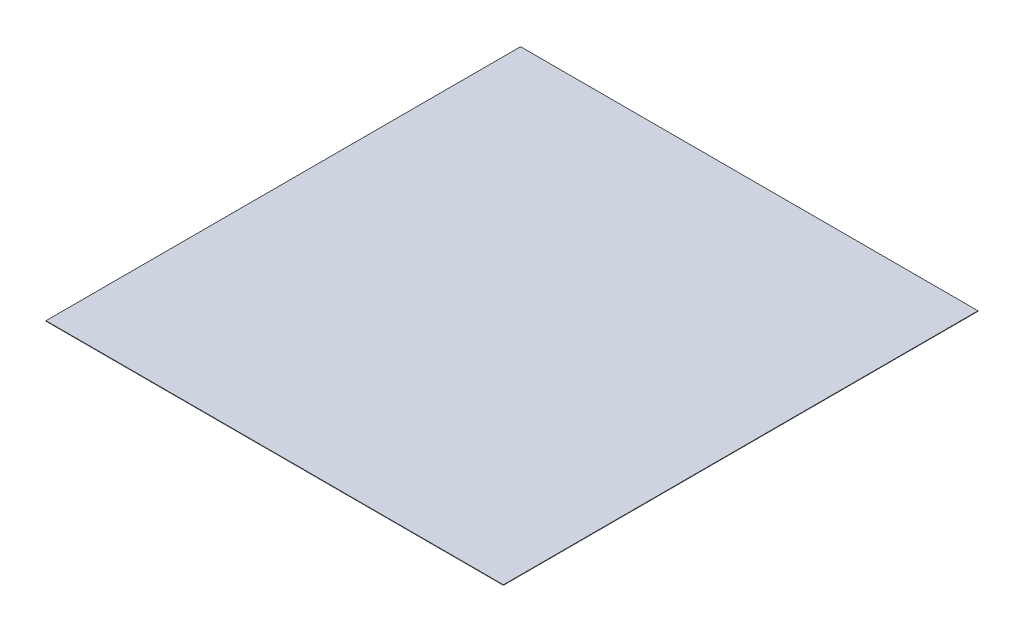
ISO-10303-21;
HEADER;
FILE_DESCRIPTION(('STEP AP214'),'2;1');
FILE_NAME('part.step','',(''),(''),'','','');
FILE_SCHEMA(('AUTOMOTIVE_DESIGN { 1 0 10303 214 1 1 1 1 }'));
ENDSEC;
DATA;
#1=APPLICATION_CONTEXT('core data for automotive mechanical design processes');
#2=APPLICATION_PROTOCOL_DEFINITION('international standard','automotive_design',2000,#1);
#3=PRODUCT_CONTEXT('',#1,'mechanical');
#4=PRODUCT('Part','Part','',(#3));
#5=PRODUCT_RELATED_PRODUCT_CATEGORY('part','',(#4));
#6=PRODUCT_DEFINITION_FORMATION('','',#4);
#7=PRODUCT_DEFINITION_CONTEXT('part definition',#1,'design');
#8=PRODUCT_DEFINITION('design','',#6,#7);
#9=PRODUCT_DEFINITION_SHAPE('','',#8);
#10=(LENGTH_UNIT() NAMED_UNIT(*) SI_UNIT(.MILLI.,.METRE.));
#11=(NAMED_UNIT(*) PLANE_ANGLE_UNIT() SI_UNIT($,.RADIAN.));
#12=(NAMED_UNIT(*) SI_UNIT($,.STERADIAN.) SOLID_ANGLE_UNIT());
#13=UNCERTAINTY_MEASURE_WITH_UNIT(LENGTH_MEASURE(1.E-05),#10,'distance_accuracy_value','');
#14=(GEOMETRIC_REPRESENTATION_CONTEXT(3) GLOBAL_UNCERTAINTY_ASSIGNED_CONTEXT((#13)) GLOBAL_UNIT_ASSIGNED_CONTEXT((#10,
#11,#12)) REPRESENTATION_CONTEXT('',''));
#15=CARTESIAN_POINT('',(0.,0.,0.));
#16=DIRECTION('',(0.,0.,1.));
#17=DIRECTION('',(1.,0.,0.));
#18=AXIS2_PLACEMENT_3D('',#15,#16,#17);
#19=CARTESIAN_POINT('',(-500.,1.,-518.75));
#20=DIRECTION('',(1.,0.,0.));
#21=DIRECTION('',(0.,0.,-1.));
#22=AXIS2_PLACEMENT_3D('',#19,#20,#21);
#23=PLANE('',#22);
#24=DIRECTION('',(0.,0.,1.));
#25=VECTOR('',#24,1.);
#26=CARTESIAN_POINT('',(-500.,0.,-518.75));
#27=LINE('',#26,#25);
#28=CARTESIAN_POINT('',(-500.,0.,-518.75));
#29=VERTEX_POINT('',#28);
#30=CARTESIAN_POINT('',(-500.,0.,518.75));
#31=VERTEX_POINT('',#30);
#32=EDGE_CURVE('E106',#29,#31,#27,.T.);
#33=ORIENTED_EDGE('',*,*,#32,.T.);
#34=DIRECTION('',(0.,-1.,0.));
#35=VECTOR('',#34,1.);
#36=CARTESIAN_POINT('',(-500.,1.,518.75));
#37=LINE('',#36,#35);
#38=CARTESIAN_POINT('',(-500.,1.,518.75));
#39=VERTEX_POINT('',#38);
#40=EDGE_CURVE('E11',#39,#31,#37,.T.);
#41=ORIENTED_EDGE('',*,*,#40,.F.);
#42=DIRECTION('',(0.,0.,1.));
#43=VECTOR('',#42,1.);
#44=CARTESIAN_POINT('',(-500.,1.,-518.75));
#45=LINE('',#44,#43);
#46=CARTESIAN_POINT('',(-500.,1.,-518.75));
#47=VERTEX_POINT('',#46);
#48=EDGE_CURVE('E94',#47,#39,#45,.T.);
#49=ORIENTED_EDGE('',*,*,#48,.F.);
#50=DIRECTION('',(0.,-1.,0.));
#51=VECTOR('',#50,1.);
#52=CARTESIAN_POINT('',(-500.,1.,-518.75));
#53=LINE('',#52,#51);
#54=EDGE_CURVE('E102',#47,#29,#53,.T.);
#55=ORIENTED_EDGE('',*,*,#54,.T.);
#56=EDGE_LOOP('',(#33,#41,#49,#55));
#57=FACE_BOUND('',#56,.T.);
#58=ADVANCED_FACE('F43',(#57),#23,.F.);
#59=CARTESIAN_POINT('',(500.,1.,518.75));
#60=DIRECTION('',(0.,0.,-1.));
#61=DIRECTION('',(-1.,0.,0.));
#62=AXIS2_PLACEMENT_3D('',#59,#60,#61);
#63=PLANE('',#62);
#64=DIRECTION('',(1.,0.,0.));
#65=VECTOR('',#64,1.);
#66=CARTESIAN_POINT('',(500.,0.,518.75));
#67=LINE('',#66,#65);
#68=CARTESIAN_POINT('',(500.,0.,518.75));
#69=VERTEX_POINT('',#68);
#70=EDGE_CURVE('E98',#31,#69,#67,.T.);
#71=ORIENTED_EDGE('',*,*,#70,.T.);
#72=DIRECTION('',(0.,-1.,0.));
#73=VECTOR('',#72,1.);
#74=CARTESIAN_POINT('',(500.,1.,518.75));
#75=LINE('',#74,#73);
#76=CARTESIAN_POINT('',(500.,1.,518.75));
#77=VERTEX_POINT('',#76);
#78=EDGE_CURVE('E51',#77,#69,#75,.T.);
#79=ORIENTED_EDGE('',*,*,#78,.F.);
#80=DIRECTION('',(1.,0.,0.));
#81=VECTOR('',#80,1.);
#82=CARTESIAN_POINT('',(500.,1.,518.75));
#83=LINE('',#82,#81);
#84=EDGE_CURVE('E89',#39,#77,#83,.T.);
#85=ORIENTED_EDGE('',*,*,#84,.F.);
#86=ORIENTED_EDGE('',*,*,#40,.T.);
#87=EDGE_LOOP('',(#71,#79,#85,#86));
#88=FACE_BOUND('',#87,.T.);
#89=ADVANCED_FACE('F97',(#88),#63,.F.);
#90=CARTESIAN_POINT('',(500.,1.,-518.75));
#91=DIRECTION('',(-1.,0.,0.));
#92=DIRECTION('',(0.,0.,1.));
#93=AXIS2_PLACEMENT_3D('',#90,#91,#92);
#94=PLANE('',#93);
#95=DIRECTION('',(0.,0.,-1.));
#96=VECTOR('',#95,1.);
#97=CARTESIAN_POINT('',(500.,0.,-518.75));
#98=LINE('',#97,#96);
#99=CARTESIAN_POINT('',(500.,0.,-518.75));
#100=VERTEX_POINT('',#99);
#101=EDGE_CURVE('E76',#69,#100,#98,.T.);
#102=ORIENTED_EDGE('',*,*,#101,.T.);
#103=DIRECTION('',(0.,-1.,0.));
#104=VECTOR('',#103,1.);
#105=CARTESIAN_POINT('',(500.,1.,-518.75));
#106=LINE('',#105,#104);
#107=CARTESIAN_POINT('',(500.,1.,-518.75));
#108=VERTEX_POINT('',#107);
#109=EDGE_CURVE('E99',#108,#100,#106,.T.);
#110=ORIENTED_EDGE('',*,*,#109,.F.);
#111=DIRECTION('',(0.,0.,-1.));
#112=VECTOR('',#111,1.);
#113=CARTESIAN_POINT('',(500.,1.,-518.75));
#114=LINE('',#113,#112);
#115=EDGE_CURVE('E92',#77,#108,#114,.T.);
#116=ORIENTED_EDGE('',*,*,#115,.F.);
#117=ORIENTED_EDGE('',*,*,#78,.T.);
#118=EDGE_LOOP('',(#102,#110,#116,#117));
#119=FACE_BOUND('',#118,.T.);
#120=ADVANCED_FACE('F100',(#119),#94,.F.);
#121=CARTESIAN_POINT('',(500.,1.,-518.75));
#122=DIRECTION('',(0.,0.,1.));
#123=DIRECTION('',(1.,0.,0.));
#124=AXIS2_PLACEMENT_3D('',#121,#122,#123);
#125=PLANE('',#124);
#126=DIRECTION('',(-1.,0.,0.));
#127=VECTOR('',#126,1.);
#128=CARTESIAN_POINT('',(500.,0.,-518.75));
#129=LINE('',#128,#127);
#130=EDGE_CURVE('E82',#100,#29,#129,.T.);
#131=ORIENTED_EDGE('',*,*,#130,.T.);
#132=ORIENTED_EDGE('',*,*,#54,.F.);
#133=DIRECTION('',(-1.,0.,0.));
#134=VECTOR('',#133,1.);
#135=CARTESIAN_POINT('',(500.,1.,-518.75));
#136=LINE('',#135,#134);
#137=EDGE_CURVE('E59',#108,#47,#136,.T.);
#138=ORIENTED_EDGE('',*,*,#137,.F.);
#139=ORIENTED_EDGE('',*,*,#109,.T.);
#140=EDGE_LOOP('',(#131,#132,#138,#139));
#141=FACE_BOUND('',#140,.T.);
#142=ADVANCED_FACE('F113',(#141),#125,.F.);
#143=CARTESIAN_POINT('',(0.,1.,0.));
#144=DIRECTION('',(0.,-1.,0.));
#145=DIRECTION('',(0.,0.,-1.));
#146=AXIS2_PLACEMENT_3D('',#143,#144,#145);
#147=PLANE('',#146);
#148=ORIENTED_EDGE('',*,*,#48,.T.);
#149=ORIENTED_EDGE('',*,*,#84,.T.);
#150=ORIENTED_EDGE('',*,*,#115,.T.);
#151=ORIENTED_EDGE('',*,*,#137,.T.);
#152=EDGE_LOOP('',(#148,#149,#150,#151));
#153=FACE_BOUND('',#152,.T.);
#154=ADVANCED_FACE('F90',(#153),#147,.F.);
#155=CARTESIAN_POINT('',(0.,0.,0.));
#156=DIRECTION('',(0.,-1.,0.));
#157=DIRECTION('',(0.,0.,-1.));
#158=AXIS2_PLACEMENT_3D('',#155,#156,#157);
#159=PLANE('',#158);
#160=ORIENTED_EDGE('',*,*,#32,.F.);
#161=ORIENTED_EDGE('',*,*,#130,.F.);
#162=ORIENTED_EDGE('',*,*,#101,.F.);
#163=ORIENTED_EDGE('',*,*,#70,.F.);
#164=EDGE_LOOP('',(#160,#161,#162,#163));
#165=FACE_BOUND('',#164,.T.);
#166=ADVANCED_FACE('F116',(#165),#159,.T.);
#167=CLOSED_SHELL('',(#58,#89,#120,#142,#154,#166));
#168=MANIFOLD_SOLID_BREP('B2',#167);
#169=ADVANCED_BREP_SHAPE_REPRESENTATION('',(#18,#168),#14);
#170=SHAPE_DEFINITION_REPRESENTATION(#9,#169);
ENDSEC;
END-ISO-10303-21;
